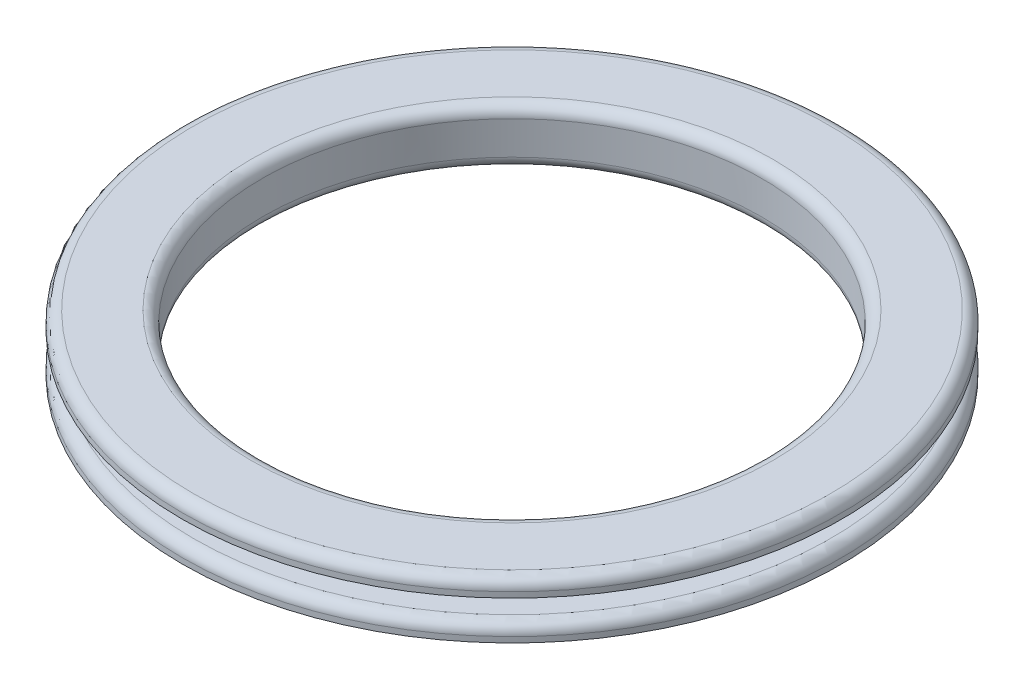
ISO-10303-21;
HEADER;
FILE_DESCRIPTION(('STEP AP214'),'2;1');
FILE_NAME('part.step','',(''),(''),'','','');
FILE_SCHEMA(('AUTOMOTIVE_DESIGN { 1 0 10303 214 1 1 1 1 }'));
ENDSEC;
DATA;
#1=APPLICATION_CONTEXT('core data for automotive mechanical design processes');
#2=APPLICATION_PROTOCOL_DEFINITION('international standard','automotive_design',2000,#1);
#3=PRODUCT_CONTEXT('',#1,'mechanical');
#4=PRODUCT('Part','Part','',(#3));
#5=PRODUCT_RELATED_PRODUCT_CATEGORY('part','',(#4));
#6=PRODUCT_DEFINITION_FORMATION('','',#4);
#7=PRODUCT_DEFINITION_CONTEXT('part definition',#1,'design');
#8=PRODUCT_DEFINITION('design','',#6,#7);
#9=PRODUCT_DEFINITION_SHAPE('','',#8);
#10=(LENGTH_UNIT() NAMED_UNIT(*) SI_UNIT(.MILLI.,.METRE.));
#11=(NAMED_UNIT(*) PLANE_ANGLE_UNIT() SI_UNIT($,.RADIAN.));
#12=(NAMED_UNIT(*) SI_UNIT($,.STERADIAN.) SOLID_ANGLE_UNIT());
#13=UNCERTAINTY_MEASURE_WITH_UNIT(LENGTH_MEASURE(1.E-05),#10,'distance_accuracy_value','');
#14=(GEOMETRIC_REPRESENTATION_CONTEXT(3) GLOBAL_UNCERTAINTY_ASSIGNED_CONTEXT((#13)) GLOBAL_UNIT_ASSIGNED_CONTEXT((#10,
#11,#12)) REPRESENTATION_CONTEXT('',''));
#15=CARTESIAN_POINT('',(0.,0.,0.));
#16=DIRECTION('',(0.,0.,1.));
#17=DIRECTION('',(1.,0.,0.));
#18=AXIS2_PLACEMENT_3D('',#15,#16,#17);
#19=CARTESIAN_POINT('',(-11.8717524104385,0.,0.));
#20=DIRECTION('',(0.,-1.,0.));
#21=DIRECTION('',(0.,0.,-1.));
#22=AXIS2_PLACEMENT_3D('',#19,#20,#21);
#23=PLANE('',#22);
#24=CARTESIAN_POINT('',(0.,0.,0.));
#25=DIRECTION('',(0.,-1.,0.));
#26=DIRECTION('',(0.,0.,-1.));
#27=AXIS2_PLACEMENT_3D('',#24,#25,#26);
#28=CIRCLE('',#27,9.4);
#29=CARTESIAN_POINT('',(0.,0.,-9.4));
#30=VERTEX_POINT('',#29);
#31=EDGE_CURVE('E43',#30,#30,#28,.F.);
#32=ORIENTED_EDGE('',*,*,#31,.T.);
#33=EDGE_LOOP('',(#32));
#34=FACE_BOUND('',#33,.T.);
#35=CARTESIAN_POINT('',(0.,0.,0.));
#36=DIRECTION('',(0.,1.,0.));
#37=DIRECTION('',(0.,0.,1.));
#38=AXIS2_PLACEMENT_3D('',#35,#36,#37);
#39=CIRCLE('',#38,11.8717524104385);
#40=CARTESIAN_POINT('',(0.,0.,11.8717524104385));
#41=VERTEX_POINT('',#40);
#42=EDGE_CURVE('E72',#41,#41,#39,.T.);
#43=ORIENTED_EDGE('',*,*,#42,.F.);
#44=EDGE_LOOP('',(#43));
#45=FACE_BOUND('',#44,.T.);
#46=ADVANCED_FACE('F31',(#34,#45),#23,.T.);
#47=CARTESIAN_POINT('',(0.,7.24686622926984,0.));
#48=DIRECTION('',(0.,1.,0.));
#49=DIRECTION('',(0.,0.,1.));
#50=AXIS2_PLACEMENT_3D('',#47,#48,#49);
#51=CYLINDRICAL_SURFACE('',#50,9.);
#52=CARTESIAN_POINT('',(0.,0.4,0.));
#53=DIRECTION('',(0.,-1.,0.));
#54=DIRECTION('',(0.,0.,-1.));
#55=AXIS2_PLACEMENT_3D('',#52,#53,#54);
#56=CIRCLE('',#55,9.);
#57=CARTESIAN_POINT('',(0.,0.4,-9.));
#58=VERTEX_POINT('',#57);
#59=EDGE_CURVE('E10',#58,#58,#56,.T.);
#60=ORIENTED_EDGE('',*,*,#59,.T.);
#61=EDGE_LOOP('',(#60));
#62=FACE_BOUND('',#61,.T.);
#63=CARTESIAN_POINT('',(0.,1.6,0.));
#64=DIRECTION('',(0.,1.,0.));
#65=DIRECTION('',(0.,0.,1.));
#66=AXIS2_PLACEMENT_3D('',#63,#64,#65);
#67=CIRCLE('',#66,9.);
#68=CARTESIAN_POINT('',(0.,1.6,9.));
#69=VERTEX_POINT('',#68);
#70=EDGE_CURVE('E39',#69,#69,#67,.T.);
#71=ORIENTED_EDGE('',*,*,#70,.T.);
#72=EDGE_LOOP('',(#71));
#73=FACE_BOUND('',#72,.T.);
#74=ADVANCED_FACE('F99',(#62,#73),#51,.F.);
#75=CARTESIAN_POINT('',(-9.,2.,0.));
#76=DIRECTION('',(0.,1.,0.));
#77=DIRECTION('',(0.,0.,1.));
#78=AXIS2_PLACEMENT_3D('',#75,#76,#77);
#79=PLANE('',#78);
#80=CARTESIAN_POINT('',(0.,2.,0.));
#81=DIRECTION('',(0.,1.,0.));
#82=DIRECTION('',(0.,0.,1.));
#83=AXIS2_PLACEMENT_3D('',#80,#81,#82);
#84=CIRCLE('',#83,11.4717524104385);
#85=CARTESIAN_POINT('',(0.,2.,11.4717524104385));
#86=VERTEX_POINT('',#85);
#87=EDGE_CURVE('E51',#86,#86,#84,.T.);
#88=ORIENTED_EDGE('',*,*,#87,.T.);
#89=EDGE_LOOP('',(#88));
#90=FACE_BOUND('',#89,.T.);
#91=CARTESIAN_POINT('',(0.,2.,0.));
#92=DIRECTION('',(0.,1.,0.));
#93=DIRECTION('',(0.,0.,1.));
#94=AXIS2_PLACEMENT_3D('',#91,#92,#93);
#95=CIRCLE('',#94,9.4);
#96=CARTESIAN_POINT('',(0.,2.,9.4));
#97=VERTEX_POINT('',#96);
#98=EDGE_CURVE('E54',#97,#97,#95,.F.);
#99=ORIENTED_EDGE('',*,*,#98,.T.);
#100=EDGE_LOOP('',(#99));
#101=FACE_BOUND('',#100,.T.);
#102=ADVANCED_FACE('F105',(#90,#101),#79,.T.);
#103=CARTESIAN_POINT('',(0.,7.24686622926984,0.));
#104=DIRECTION('',(0.,1.,0.));
#105=DIRECTION('',(0.,0.,1.));
#106=AXIS2_PLACEMENT_3D('',#103,#104,#105);
#107=CYLINDRICAL_SURFACE('',#106,11.8717524104385);
#108=CARTESIAN_POINT('',(0.,1.6,0.));
#109=DIRECTION('',(0.,1.,0.));
#110=DIRECTION('',(0.,0.,1.));
#111=AXIS2_PLACEMENT_3D('',#108,#109,#110);
#112=CIRCLE('',#111,11.8717524104385);
#113=CARTESIAN_POINT('',(0.,1.6,11.8717524104385));
#114=VERTEX_POINT('',#113);
#115=EDGE_CURVE('E48',#114,#114,#112,.F.);
#116=ORIENTED_EDGE('',*,*,#115,.T.);
#117=EDGE_LOOP('',(#116));
#118=FACE_BOUND('',#117,.T.);
#119=CARTESIAN_POINT('',(0.,1.4,0.));
#120=DIRECTION('',(0.,1.,0.));
#121=DIRECTION('',(0.,0.,1.));
#122=AXIS2_PLACEMENT_3D('',#119,#120,#121);
#123=CIRCLE('',#122,11.8717524104385);
#124=CARTESIAN_POINT('',(0.,1.4,11.8717524104385));
#125=VERTEX_POINT('',#124);
#126=EDGE_CURVE('E69',#125,#125,#123,.T.);
#127=ORIENTED_EDGE('',*,*,#126,.T.);
#128=EDGE_LOOP('',(#127));
#129=FACE_BOUND('',#128,.T.);
#130=ADVANCED_FACE('F111',(#118,#129),#107,.T.);
#131=CARTESIAN_POINT('',(-11.8717524104385,1.4,0.));
#132=DIRECTION('',(0.,-1.,0.));
#133=DIRECTION('',(0.,0.,-1.));
#134=AXIS2_PLACEMENT_3D('',#131,#132,#133);
#135=PLANE('',#134);
#136=CARTESIAN_POINT('',(0.,1.4,0.));
#137=DIRECTION('',(0.,-1.,0.));
#138=DIRECTION('',(0.,0.,-1.));
#139=AXIS2_PLACEMENT_3D('',#136,#137,#138);
#140=CIRCLE('',#139,10.5534134717167);
#141=CARTESIAN_POINT('',(0.,1.4,-10.5534134717167));
#142=VERTEX_POINT('',#141);
#143=EDGE_CURVE('E57',#142,#142,#140,.F.);
#144=ORIENTED_EDGE('',*,*,#143,.T.);
#145=EDGE_LOOP('',(#144));
#146=FACE_BOUND('',#145,.T.);
#147=ORIENTED_EDGE('',*,*,#126,.F.);
#148=EDGE_LOOP('',(#147));
#149=FACE_BOUND('',#148,.T.);
#150=ADVANCED_FACE('F115',(#146,#149),#135,.T.);
#151=CARTESIAN_POINT('',(-10.1534134717167,0.6,0.));
#152=DIRECTION('',(0.,1.,0.));
#153=DIRECTION('',(0.,0.,1.));
#154=AXIS2_PLACEMENT_3D('',#151,#152,#153);
#155=PLANE('',#154);
#156=CARTESIAN_POINT('',(0.,0.6,0.));
#157=DIRECTION('',(0.,1.,0.));
#158=DIRECTION('',(0.,0.,1.));
#159=AXIS2_PLACEMENT_3D('',#156,#157,#158);
#160=CIRCLE('',#159,11.4717524104385);
#161=CARTESIAN_POINT('',(0.,0.6,11.4717524104385));
#162=VERTEX_POINT('',#161);
#163=EDGE_CURVE('E63',#162,#162,#160,.T.);
#164=ORIENTED_EDGE('',*,*,#163,.T.);
#165=EDGE_LOOP('',(#164));
#166=FACE_BOUND('',#165,.T.);
#167=CARTESIAN_POINT('',(0.,0.6,0.));
#168=DIRECTION('',(0.,1.,0.));
#169=DIRECTION('',(0.,0.,1.));
#170=AXIS2_PLACEMENT_3D('',#167,#168,#169);
#171=CIRCLE('',#170,10.5534134717167);
#172=CARTESIAN_POINT('',(0.,0.6,10.5534134717167));
#173=VERTEX_POINT('',#172);
#174=EDGE_CURVE('E66',#173,#173,#171,.F.);
#175=ORIENTED_EDGE('',*,*,#174,.T.);
#176=EDGE_LOOP('',(#175));
#177=FACE_BOUND('',#176,.T.);
#178=ADVANCED_FACE('F119',(#166,#177),#155,.T.);
#179=CARTESIAN_POINT('',(0.,7.24686622926984,0.));
#180=DIRECTION('',(0.,1.,0.));
#181=DIRECTION('',(0.,0.,1.));
#182=AXIS2_PLACEMENT_3D('',#179,#180,#181);
#183=CYLINDRICAL_SURFACE('',#182,11.8717524104385);
#184=CARTESIAN_POINT('',(0.,0.2,0.));
#185=DIRECTION('',(0.,1.,0.));
#186=DIRECTION('',(0.,0.,1.));
#187=AXIS2_PLACEMENT_3D('',#184,#185,#186);
#188=CIRCLE('',#187,11.8717524104385);
#189=CARTESIAN_POINT('',(0.,0.2,11.8717524104385));
#190=VERTEX_POINT('',#189);
#191=EDGE_CURVE('E60',#190,#190,#188,.F.);
#192=ORIENTED_EDGE('',*,*,#191,.T.);
#193=EDGE_LOOP('',(#192));
#194=FACE_BOUND('',#193,.T.);
#195=ORIENTED_EDGE('',*,*,#42,.T.);
#196=EDGE_LOOP('',(#195));
#197=FACE_BOUND('',#196,.T.);
#198=ADVANCED_FACE('F93',(#194,#197),#183,.T.);
#199=CARTESIAN_POINT('',(0.,0.2,0.));
#200=DIRECTION('',(0.,1.,0.));
#201=DIRECTION('',(0.,0.,1.));
#202=AXIS2_PLACEMENT_3D('',#199,#200,#201);
#203=TOROIDAL_SURFACE('',#202,11.4717524104385,0.4);
#204=ORIENTED_EDGE('',*,*,#191,.F.);
#205=EDGE_LOOP('',(#204));
#206=FACE_BOUND('',#205,.T.);
#207=ORIENTED_EDGE('',*,*,#163,.F.);
#208=EDGE_LOOP('',(#207));
#209=FACE_BOUND('',#208,.T.);
#210=ADVANCED_FACE('F83',(#206,#209),#203,.T.);
#211=CARTESIAN_POINT('',(0.,1.,0.));
#212=DIRECTION('',(0.,-1.,0.));
#213=DIRECTION('',(0.,0.,-1.));
#214=AXIS2_PLACEMENT_3D('',#211,#212,#213);
#215=TOROIDAL_SURFACE('',#214,10.5534134717167,0.4);
#216=ORIENTED_EDGE('',*,*,#143,.F.);
#217=EDGE_LOOP('',(#216));
#218=FACE_BOUND('',#217,.T.);
#219=CARTESIAN_POINT('',(0.,1.,0.));
#220=DIRECTION('',(0.,-1.,0.));
#221=DIRECTION('',(0.,0.,-1.));
#222=AXIS2_PLACEMENT_3D('',#219,#220,#221);
#223=CIRCLE('',#222,10.1534134717167);
#224=CARTESIAN_POINT('',(0.,1.,-10.1534134717167));
#225=VERTEX_POINT('',#224);
#226=EDGE_CURVE('E35',#225,#225,#223,.T.);
#227=ORIENTED_EDGE('',*,*,#226,.F.);
#228=EDGE_LOOP('',(#227));
#229=FACE_BOUND('',#228,.T.);
#230=ADVANCED_FACE('F81',(#218,#229),#215,.F.);
#231=CARTESIAN_POINT('',(0.,1.,0.));
#232=DIRECTION('',(0.,1.,0.));
#233=DIRECTION('',(0.,0.,1.));
#234=AXIS2_PLACEMENT_3D('',#231,#232,#233);
#235=TOROIDAL_SURFACE('',#234,10.5534134717167,0.4);
#236=ORIENTED_EDGE('',*,*,#174,.F.);
#237=EDGE_LOOP('',(#236));
#238=FACE_BOUND('',#237,.T.);
#239=ORIENTED_EDGE('',*,*,#226,.T.);
#240=EDGE_LOOP('',(#239));
#241=FACE_BOUND('',#240,.T.);
#242=ADVANCED_FACE('F79',(#238,#241),#235,.F.);
#243=CARTESIAN_POINT('',(0.,1.6,0.));
#244=DIRECTION('',(0.,1.,0.));
#245=DIRECTION('',(0.,0.,1.));
#246=AXIS2_PLACEMENT_3D('',#243,#244,#245);
#247=TOROIDAL_SURFACE('',#246,11.4717524104385,0.4);
#248=ORIENTED_EDGE('',*,*,#115,.F.);
#249=EDGE_LOOP('',(#248));
#250=FACE_BOUND('',#249,.T.);
#251=ORIENTED_EDGE('',*,*,#87,.F.);
#252=EDGE_LOOP('',(#251));
#253=FACE_BOUND('',#252,.T.);
#254=ADVANCED_FACE('F90',(#250,#253),#247,.T.);
#255=CARTESIAN_POINT('',(0.,0.4,0.));
#256=DIRECTION('',(0.,-1.,0.));
#257=DIRECTION('',(0.,0.,-1.));
#258=AXIS2_PLACEMENT_3D('',#255,#256,#257);
#259=TOROIDAL_SURFACE('',#258,9.4,0.4);
#260=ORIENTED_EDGE('',*,*,#59,.F.);
#261=EDGE_LOOP('',(#260));
#262=FACE_BOUND('',#261,.T.);
#263=ORIENTED_EDGE('',*,*,#31,.F.);
#264=EDGE_LOOP('',(#263));
#265=FACE_BOUND('',#264,.T.);
#266=ADVANCED_FACE('F158',(#262,#265),#259,.T.);
#267=CARTESIAN_POINT('',(0.,1.6,0.));
#268=DIRECTION('',(0.,1.,0.));
#269=DIRECTION('',(0.,0.,1.));
#270=AXIS2_PLACEMENT_3D('',#267,#268,#269);
#271=TOROIDAL_SURFACE('',#270,9.4,0.4);
#272=ORIENTED_EDGE('',*,*,#98,.F.);
#273=EDGE_LOOP('',(#272));
#274=FACE_BOUND('',#273,.T.);
#275=ORIENTED_EDGE('',*,*,#70,.F.);
#276=EDGE_LOOP('',(#275));
#277=FACE_BOUND('',#276,.T.);
#278=ADVANCED_FACE('F33',(#274,#277),#271,.T.);
#279=CLOSED_SHELL('',(#46,#74,#102,#130,#150,#178,#198,#210,#230,#242,#254,#266,#278));
#280=MANIFOLD_SOLID_BREP('B2',#279);
#281=ADVANCED_BREP_SHAPE_REPRESENTATION('',(#18,#280),#14);
#282=SHAPE_DEFINITION_REPRESENTATION(#9,#281);
ENDSEC;
END-ISO-10303-21;
